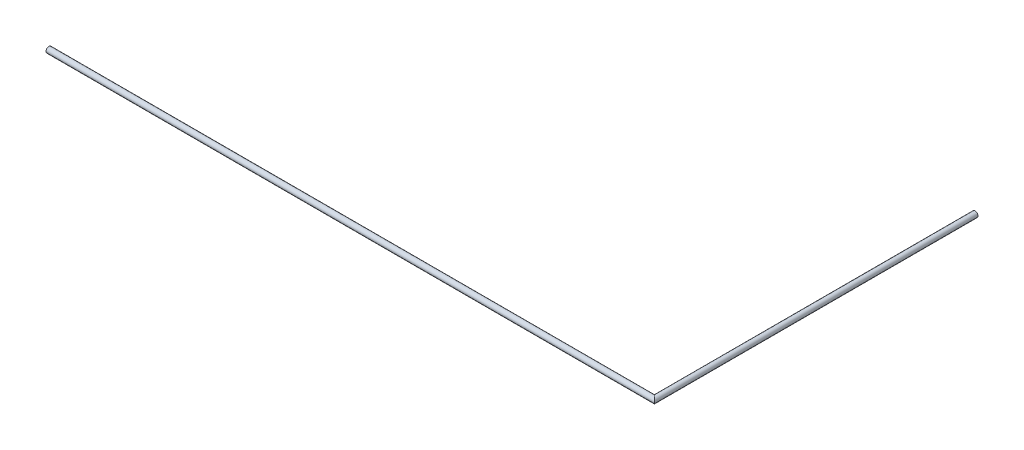
ISO-10303-21;
HEADER;
FILE_DESCRIPTION(('STEP AP214'),'2;1');
FILE_NAME('part.step','',(''),(''),'','','');
FILE_SCHEMA(('AUTOMOTIVE_DESIGN { 1 0 10303 214 1 1 1 1 }'));
ENDSEC;
DATA;
#1=APPLICATION_CONTEXT('core data for automotive mechanical design processes');
#2=APPLICATION_PROTOCOL_DEFINITION('international standard','automotive_design',2000,#1);
#3=PRODUCT_CONTEXT('',#1,'mechanical');
#4=PRODUCT('Part','Part','',(#3));
#5=PRODUCT_RELATED_PRODUCT_CATEGORY('part','',(#4));
#6=PRODUCT_DEFINITION_FORMATION('','',#4);
#7=PRODUCT_DEFINITION_CONTEXT('part definition',#1,'design');
#8=PRODUCT_DEFINITION('design','',#6,#7);
#9=PRODUCT_DEFINITION_SHAPE('','',#8);
#10=(LENGTH_UNIT() NAMED_UNIT(*) SI_UNIT(.MILLI.,.METRE.));
#11=(NAMED_UNIT(*) PLANE_ANGLE_UNIT() SI_UNIT($,.RADIAN.));
#12=(NAMED_UNIT(*) SI_UNIT($,.STERADIAN.) SOLID_ANGLE_UNIT());
#13=UNCERTAINTY_MEASURE_WITH_UNIT(LENGTH_MEASURE(1.E-05),#10,'distance_accuracy_value','');
#14=(GEOMETRIC_REPRESENTATION_CONTEXT(3) GLOBAL_UNCERTAINTY_ASSIGNED_CONTEXT((#13)) GLOBAL_UNIT_ASSIGNED_CONTEXT((#10,
#11,#12)) REPRESENTATION_CONTEXT('',''));
#15=CARTESIAN_POINT('',(0.,0.,0.));
#16=DIRECTION('',(0.,0.,1.));
#17=DIRECTION('',(1.,0.,0.));
#18=AXIS2_PLACEMENT_3D('',#15,#16,#17);
#19=CARTESIAN_POINT('',(0.,0.,30.));
#20=DIRECTION('',(0.,0.,-1.));
#21=DIRECTION('',(-1.,0.,0.));
#22=AXIS2_PLACEMENT_3D('',#19,#20,#21);
#23=CYLINDRICAL_SURFACE('',#22,12.7);
#24=CARTESIAN_POINT('',(0.,0.,0.));
#25=DIRECTION('',(0.,0.,1.));
#26=DIRECTION('',(1.,0.,0.));
#27=AXIS2_PLACEMENT_3D('',#24,#25,#26);
#28=CIRCLE('',#27,12.7);
#29=CARTESIAN_POINT('',(12.7,0.,0.));
#30=VERTEX_POINT('',#29);
#31=EDGE_CURVE('E11',#30,#30,#28,.T.);
#32=ORIENTED_EDGE('',*,*,#31,.T.);
#33=EDGE_LOOP('',(#32));
#34=FACE_BOUND('',#33,.T.);
#35=CARTESIAN_POINT('',(0.,0.,1430.));
#36=DIRECTION('',(-0.707106781186547,0.,0.707106781186547));
#37=DIRECTION('',(0.707106781186548,0.,0.707106781186548));
#38=AXIS2_PLACEMENT_3D('',#35,#36,#37);
#39=ELLIPSE('',#38,17.9605122421383,12.7);
#40=CARTESIAN_POINT('',(12.7,0.,1442.7));
#41=VERTEX_POINT('',#40);
#42=EDGE_CURVE('E42',#41,#41,#39,.F.);
#43=ORIENTED_EDGE('',*,*,#42,.T.);
#44=EDGE_LOOP('',(#43));
#45=FACE_BOUND('',#44,.T.);
#46=ADVANCED_FACE('F35',(#34,#45),#23,.T.);
#47=CARTESIAN_POINT('',(0.,0.,0.));
#48=DIRECTION('',(0.,0.,1.));
#49=DIRECTION('',(1.,0.,0.));
#50=AXIS2_PLACEMENT_3D('',#47,#48,#49);
#51=PLANE('',#50);
#52=ORIENTED_EDGE('',*,*,#31,.F.);
#53=EDGE_LOOP('',(#52));
#54=FACE_BOUND('',#53,.T.);
#55=ADVANCED_FACE('F56',(#54),#51,.F.);
#56=CARTESIAN_POINT('',(-2700.,-2.74846342770599E-13,1430.));
#57=DIRECTION('',(-1.,0.,0.));
#58=DIRECTION('',(0.,0.,1.));
#59=AXIS2_PLACEMENT_3D('',#56,#57,#58);
#60=PLANE('',#59);
#61=CARTESIAN_POINT('',(-2700.,-2.74846342770599E-13,1430.));
#62=DIRECTION('',(-1.,0.,0.));
#63=DIRECTION('',(0.,0.,1.));
#64=AXIS2_PLACEMENT_3D('',#61,#62,#63);
#65=CIRCLE('',#64,12.7);
#66=CARTESIAN_POINT('',(-2700.,-2.76139138531038E-13,1442.7));
#67=VERTEX_POINT('',#66);
#68=EDGE_CURVE('E47',#67,#67,#65,.T.);
#69=ORIENTED_EDGE('',*,*,#68,.T.);
#70=EDGE_LOOP('',(#69));
#71=FACE_BOUND('',#70,.T.);
#72=ADVANCED_FACE('F61',(#71),#60,.T.);
#73=CARTESIAN_POINT('',(14.0699999999997,0.,1430.));
#74=DIRECTION('',(-1.,0.,0.));
#75=DIRECTION('',(0.,-1.,0.));
#76=AXIS2_PLACEMENT_3D('',#73,#74,#75);
#77=CYLINDRICAL_SURFACE('',#76,12.7);
#78=ORIENTED_EDGE('',*,*,#42,.F.);
#79=EDGE_LOOP('',(#78));
#80=FACE_BOUND('',#79,.T.);
#81=ORIENTED_EDGE('',*,*,#68,.F.);
#82=EDGE_LOOP('',(#81));
#83=FACE_BOUND('',#82,.T.);
#84=ADVANCED_FACE('F51',(#80,#83),#77,.T.);
#85=CLOSED_SHELL('',(#46,#55,#72,#84));
#86=MANIFOLD_SOLID_BREP('B2',#85);
#87=ADVANCED_BREP_SHAPE_REPRESENTATION('',(#18,#86),#14);
#88=SHAPE_DEFINITION_REPRESENTATION(#9,#87);
ENDSEC;
END-ISO-10303-21;
